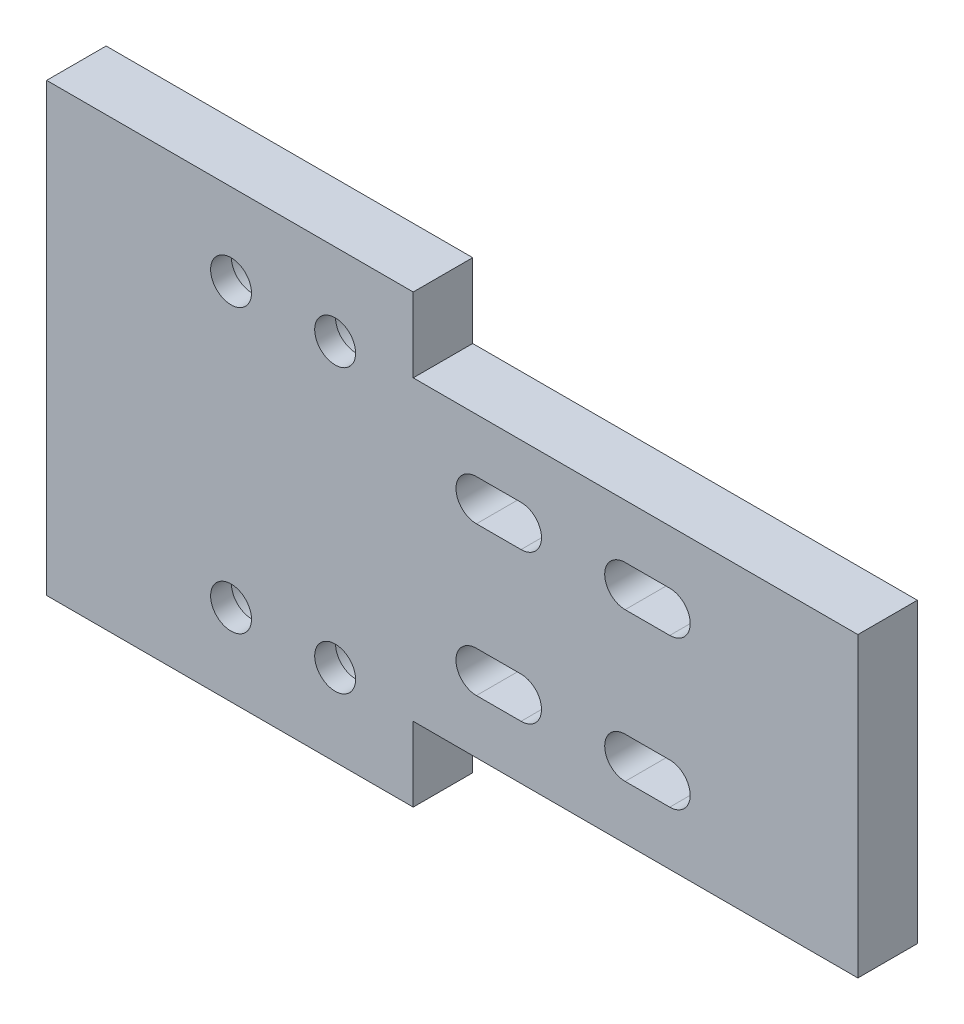
ISO-10303-21;
HEADER;
FILE_DESCRIPTION(('STEP AP214'),'2;1');
FILE_NAME('part.step','',(''),(''),'','','');
FILE_SCHEMA(('AUTOMOTIVE_DESIGN { 1 0 10303 214 1 1 1 1 }'));
ENDSEC;
DATA;
#1=APPLICATION_CONTEXT('core data for automotive mechanical design processes');
#2=APPLICATION_PROTOCOL_DEFINITION('international standard','automotive_design',2000,#1);
#3=PRODUCT_CONTEXT('',#1,'mechanical');
#4=PRODUCT('Part','Part','',(#3));
#5=PRODUCT_RELATED_PRODUCT_CATEGORY('part','',(#4));
#6=PRODUCT_DEFINITION_FORMATION('','',#4);
#7=PRODUCT_DEFINITION_CONTEXT('part definition',#1,'design');
#8=PRODUCT_DEFINITION('design','',#6,#7);
#9=PRODUCT_DEFINITION_SHAPE('','',#8);
#10=(LENGTH_UNIT() NAMED_UNIT(*) SI_UNIT(.MILLI.,.METRE.));
#11=(NAMED_UNIT(*) PLANE_ANGLE_UNIT() SI_UNIT($,.RADIAN.));
#12=(NAMED_UNIT(*) SI_UNIT($,.STERADIAN.) SOLID_ANGLE_UNIT());
#13=UNCERTAINTY_MEASURE_WITH_UNIT(LENGTH_MEASURE(1.E-05),#10,'distance_accuracy_value','');
#14=(GEOMETRIC_REPRESENTATION_CONTEXT(3) GLOBAL_UNCERTAINTY_ASSIGNED_CONTEXT((#13)) GLOBAL_UNIT_ASSIGNED_CONTEXT((#10,
#11,#12)) REPRESENTATION_CONTEXT('',''));
#15=CARTESIAN_POINT('',(0.,0.,0.));
#16=DIRECTION('',(0.,0.,1.));
#17=DIRECTION('',(1.,0.,0.));
#18=AXIS2_PLACEMENT_3D('',#15,#16,#17);
#19=CARTESIAN_POINT('',(336.3,320.,246.));
#20=DIRECTION('',(0.,-1.,0.));
#21=DIRECTION('',(0.,0.,-1.));
#22=AXIS2_PLACEMENT_3D('',#19,#20,#21);
#23=PLANE('',#22);
#24=DIRECTION('',(0.,0.,-1.));
#25=VECTOR('',#24,1.);
#26=CARTESIAN_POINT('',(276.5,320.,246.));
#27=LINE('',#26,#25);
#28=CARTESIAN_POINT('',(276.5,320.,246.));
#29=VERTEX_POINT('',#28);
#30=CARTESIAN_POINT('',(276.5,320.,238.));
#31=VERTEX_POINT('',#30);
#32=EDGE_CURVE('E56',#29,#31,#27,.T.);
#33=ORIENTED_EDGE('',*,*,#32,.F.);
#34=DIRECTION('',(-1.,0.,0.));
#35=VECTOR('',#34,1.);
#36=CARTESIAN_POINT('',(336.3,320.,246.));
#37=LINE('',#36,#35);
#38=CARTESIAN_POINT('',(336.3,320.,246.));
#39=VERTEX_POINT('',#38);
#40=EDGE_CURVE('E212',#39,#29,#37,.T.);
#41=ORIENTED_EDGE('',*,*,#40,.F.);
#42=DIRECTION('',(0.,0.,-1.));
#43=VECTOR('',#42,1.);
#44=CARTESIAN_POINT('',(336.3,320.,246.));
#45=LINE('',#44,#43);
#46=CARTESIAN_POINT('',(336.3,320.,238.));
#47=VERTEX_POINT('',#46);
#48=EDGE_CURVE('E48',#39,#47,#45,.T.);
#49=ORIENTED_EDGE('',*,*,#48,.T.);
#50=DIRECTION('',(-1.,0.,0.));
#51=VECTOR('',#50,1.);
#52=CARTESIAN_POINT('',(336.3,320.,238.));
#53=LINE('',#52,#51);
#54=EDGE_CURVE('E378',#47,#31,#53,.T.);
#55=ORIENTED_EDGE('',*,*,#54,.T.);
#56=EDGE_LOOP('',(#33,#41,#49,#55));
#57=FACE_BOUND('',#56,.T.);
#58=ADVANCED_FACE('F39',(#57),#23,.F.);
#59=CARTESIAN_POINT('',(0.,0.,246.));
#60=DIRECTION('',(0.,0.,1.));
#61=DIRECTION('',(1.,0.,0.));
#62=AXIS2_PLACEMENT_3D('',#59,#60,#61);
#63=PLANE('',#62);
#64=CARTESIAN_POINT('',(252.,319.,246.));
#65=DIRECTION('',(0.,0.,1.));
#66=DIRECTION('',(1.,0.,0.));
#67=AXIS2_PLACEMENT_3D('',#64,#65,#66);
#68=CIRCLE('',#67,2.74999999999997);
#69=CARTESIAN_POINT('',(254.75,319.,246.));
#70=VERTEX_POINT('',#69);
#71=EDGE_CURVE('E411',#70,#70,#68,.T.);
#72=ORIENTED_EDGE('',*,*,#71,.F.);
#73=EDGE_LOOP('',(#72));
#74=FACE_BOUND('',#73,.T.);
#75=CARTESIAN_POINT('',(266.,281.,246.));
#76=DIRECTION('',(0.,0.,1.));
#77=DIRECTION('',(1.,0.,0.));
#78=AXIS2_PLACEMENT_3D('',#75,#76,#77);
#79=CIRCLE('',#78,2.74999999999997);
#80=CARTESIAN_POINT('',(268.75,281.,246.));
#81=VERTEX_POINT('',#80);
#82=EDGE_CURVE('E406',#81,#81,#79,.T.);
#83=ORIENTED_EDGE('',*,*,#82,.F.);
#84=EDGE_LOOP('',(#83));
#85=FACE_BOUND('',#84,.T.);
#86=CARTESIAN_POINT('',(266.,319.,246.));
#87=DIRECTION('',(0.,0.,1.));
#88=DIRECTION('',(1.,0.,0.));
#89=AXIS2_PLACEMENT_3D('',#86,#87,#88);
#90=CIRCLE('',#89,2.74999999999997);
#91=CARTESIAN_POINT('',(268.75,319.,246.));
#92=VERTEX_POINT('',#91);
#93=EDGE_CURVE('E402',#92,#92,#90,.T.);
#94=ORIENTED_EDGE('',*,*,#93,.F.);
#95=EDGE_LOOP('',(#94));
#96=FACE_BOUND('',#95,.T.);
#97=CARTESIAN_POINT('',(252.,281.,246.));
#98=DIRECTION('',(0.,0.,1.));
#99=DIRECTION('',(1.,0.,0.));
#100=AXIS2_PLACEMENT_3D('',#97,#98,#99);
#101=CIRCLE('',#100,2.74999999999997);
#102=CARTESIAN_POINT('',(254.75,281.,246.));
#103=VERTEX_POINT('',#102);
#104=EDGE_CURVE('E233',#103,#103,#101,.T.);
#105=ORIENTED_EDGE('',*,*,#104,.F.);
#106=EDGE_LOOP('',(#105));
#107=FACE_BOUND('',#106,.T.);
#108=DIRECTION('',(0.,-1.,0.));
#109=VECTOR('',#108,1.);
#110=CARTESIAN_POINT('',(227.2,320.,246.));
#111=LINE('',#110,#109);
#112=CARTESIAN_POINT('',(227.2,330.,246.));
#113=VERTEX_POINT('',#112);
#114=CARTESIAN_POINT('',(227.2,270.,246.));
#115=VERTEX_POINT('',#114);
#116=EDGE_CURVE('E375',#113,#115,#111,.T.);
#117=ORIENTED_EDGE('',*,*,#116,.T.);
#118=DIRECTION('',(1.,0.,0.));
#119=VECTOR('',#118,1.);
#120=CARTESIAN_POINT('',(227.2,270.,246.));
#121=LINE('',#120,#119);
#122=CARTESIAN_POINT('',(276.5,270.,246.));
#123=VERTEX_POINT('',#122);
#124=EDGE_CURVE('E237',#115,#123,#121,.T.);
#125=ORIENTED_EDGE('',*,*,#124,.T.);
#126=DIRECTION('',(0.,1.,0.));
#127=VECTOR('',#126,1.);
#128=CARTESIAN_POINT('',(276.5,270.,246.));
#129=LINE('',#128,#127);
#130=CARTESIAN_POINT('',(276.5,280.,246.));
#131=VERTEX_POINT('',#130);
#132=EDGE_CURVE('E239',#123,#131,#129,.T.);
#133=ORIENTED_EDGE('',*,*,#132,.T.);
#134=DIRECTION('',(1.,0.,0.));
#135=VECTOR('',#134,1.);
#136=CARTESIAN_POINT('',(227.2,280.,246.));
#137=LINE('',#136,#135);
#138=CARTESIAN_POINT('',(336.3,280.,246.));
#139=VERTEX_POINT('',#138);
#140=EDGE_CURVE('E377',#131,#139,#137,.T.);
#141=ORIENTED_EDGE('',*,*,#140,.T.);
#142=DIRECTION('',(0.,1.,0.));
#143=VECTOR('',#142,1.);
#144=CARTESIAN_POINT('',(336.3,280.,246.));
#145=LINE('',#144,#143);
#146=EDGE_CURVE('E380',#139,#39,#145,.T.);
#147=ORIENTED_EDGE('',*,*,#146,.T.);
#148=ORIENTED_EDGE('',*,*,#40,.T.);
#149=DIRECTION('',(0.,1.,0.));
#150=VECTOR('',#149,1.);
#151=CARTESIAN_POINT('',(276.5,320.,246.));
#152=LINE('',#151,#150);
#153=CARTESIAN_POINT('',(276.5,330.,246.));
#154=VERTEX_POINT('',#153);
#155=EDGE_CURVE('E205',#29,#154,#152,.T.);
#156=ORIENTED_EDGE('',*,*,#155,.T.);
#157=DIRECTION('',(-1.,0.,0.));
#158=VECTOR('',#157,1.);
#159=CARTESIAN_POINT('',(276.5,330.,246.));
#160=LINE('',#159,#158);
#161=EDGE_CURVE('E210',#154,#113,#160,.T.);
#162=ORIENTED_EDGE('',*,*,#161,.T.);
#163=EDGE_LOOP('',(#117,#125,#133,#141,#147,#148,#156,#162));
#164=FACE_BOUND('',#163,.T.);
#165=DIRECTION('',(1.,0.,0.));
#166=VECTOR('',#165,1.);
#167=CARTESIAN_POINT('',(285.,287.25,246.));
#168=LINE('',#167,#166);
#169=CARTESIAN_POINT('',(285.,287.25,246.));
#170=VERTEX_POINT('',#169);
#171=CARTESIAN_POINT('',(291.,287.25,246.));
#172=VERTEX_POINT('',#171);
#173=EDGE_CURVE('E346',#170,#172,#168,.T.);
#174=ORIENTED_EDGE('',*,*,#173,.F.);
#175=CARTESIAN_POINT('',(285.,290.,246.));
#176=DIRECTION('',(0.,0.,1.));
#177=DIRECTION('',(1.,0.,0.));
#178=AXIS2_PLACEMENT_3D('',#175,#176,#177);
#179=CIRCLE('',#178,2.75);
#180=CARTESIAN_POINT('',(285.,292.75,246.));
#181=VERTEX_POINT('',#180);
#182=EDGE_CURVE('E344',#181,#170,#179,.T.);
#183=ORIENTED_EDGE('',*,*,#182,.F.);
#184=DIRECTION('',(-1.,0.,0.));
#185=VECTOR('',#184,1.);
#186=CARTESIAN_POINT('',(291.,292.75,246.));
#187=LINE('',#186,#185);
#188=CARTESIAN_POINT('',(291.,292.75,246.));
#189=VERTEX_POINT('',#188);
#190=EDGE_CURVE('E352',#189,#181,#187,.T.);
#191=ORIENTED_EDGE('',*,*,#190,.F.);
#192=CARTESIAN_POINT('',(291.,290.,246.));
#193=DIRECTION('',(0.,0.,1.));
#194=DIRECTION('',(1.,0.,0.));
#195=AXIS2_PLACEMENT_3D('',#192,#193,#194);
#196=CIRCLE('',#195,2.75);
#197=EDGE_CURVE('E349',#172,#189,#196,.T.);
#198=ORIENTED_EDGE('',*,*,#197,.F.);
#199=EDGE_LOOP('',(#174,#183,#191,#198));
#200=FACE_BOUND('',#199,.T.);
#201=DIRECTION('',(1.,0.,0.));
#202=VECTOR('',#201,1.);
#203=CARTESIAN_POINT('',(285.,307.25,246.));
#204=LINE('',#203,#202);
#205=CARTESIAN_POINT('',(285.,307.25,246.));
#206=VERTEX_POINT('',#205);
#207=CARTESIAN_POINT('',(291.,307.25,246.));
#208=VERTEX_POINT('',#207);
#209=EDGE_CURVE('E315',#206,#208,#204,.T.);
#210=ORIENTED_EDGE('',*,*,#209,.F.);
#211=CARTESIAN_POINT('',(285.,310.,246.));
#212=DIRECTION('',(0.,0.,1.));
#213=DIRECTION('',(1.,0.,0.));
#214=AXIS2_PLACEMENT_3D('',#211,#212,#213);
#215=CIRCLE('',#214,2.75);
#216=CARTESIAN_POINT('',(285.,312.75,246.));
#217=VERTEX_POINT('',#216);
#218=EDGE_CURVE('E313',#217,#206,#215,.T.);
#219=ORIENTED_EDGE('',*,*,#218,.F.);
#220=DIRECTION('',(-1.,0.,0.));
#221=VECTOR('',#220,1.);
#222=CARTESIAN_POINT('',(291.,312.75,246.));
#223=LINE('',#222,#221);
#224=CARTESIAN_POINT('',(291.,312.75,246.));
#225=VERTEX_POINT('',#224);
#226=EDGE_CURVE('E321',#225,#217,#223,.T.);
#227=ORIENTED_EDGE('',*,*,#226,.F.);
#228=CARTESIAN_POINT('',(291.,310.,246.));
#229=DIRECTION('',(0.,0.,1.));
#230=DIRECTION('',(1.,0.,0.));
#231=AXIS2_PLACEMENT_3D('',#228,#229,#230);
#232=CIRCLE('',#231,2.75);
#233=EDGE_CURVE('E318',#208,#225,#232,.T.);
#234=ORIENTED_EDGE('',*,*,#233,.F.);
#235=EDGE_LOOP('',(#210,#219,#227,#234));
#236=FACE_BOUND('',#235,.T.);
#237=DIRECTION('',(1.,0.,0.));
#238=VECTOR('',#237,1.);
#239=CARTESIAN_POINT('',(305.,287.25,246.));
#240=LINE('',#239,#238);
#241=CARTESIAN_POINT('',(305.,287.25,246.));
#242=VERTEX_POINT('',#241);
#243=CARTESIAN_POINT('',(311.,287.25,246.));
#244=VERTEX_POINT('',#243);
#245=EDGE_CURVE('E284',#242,#244,#240,.T.);
#246=ORIENTED_EDGE('',*,*,#245,.F.);
#247=CARTESIAN_POINT('',(305.,290.,246.));
#248=DIRECTION('',(0.,0.,1.));
#249=DIRECTION('',(1.,0.,0.));
#250=AXIS2_PLACEMENT_3D('',#247,#248,#249);
#251=CIRCLE('',#250,2.75);
#252=CARTESIAN_POINT('',(305.,292.75,246.));
#253=VERTEX_POINT('',#252);
#254=EDGE_CURVE('E282',#253,#242,#251,.T.);
#255=ORIENTED_EDGE('',*,*,#254,.F.);
#256=DIRECTION('',(-1.,0.,0.));
#257=VECTOR('',#256,1.);
#258=CARTESIAN_POINT('',(311.,292.75,246.));
#259=LINE('',#258,#257);
#260=CARTESIAN_POINT('',(311.,292.75,246.));
#261=VERTEX_POINT('',#260);
#262=EDGE_CURVE('E290',#261,#253,#259,.T.);
#263=ORIENTED_EDGE('',*,*,#262,.F.);
#264=CARTESIAN_POINT('',(311.,290.,246.));
#265=DIRECTION('',(0.,0.,1.));
#266=DIRECTION('',(1.,0.,0.));
#267=AXIS2_PLACEMENT_3D('',#264,#265,#266);
#268=CIRCLE('',#267,2.75);
#269=EDGE_CURVE('E287',#244,#261,#268,.T.);
#270=ORIENTED_EDGE('',*,*,#269,.F.);
#271=EDGE_LOOP('',(#246,#255,#263,#270));
#272=FACE_BOUND('',#271,.T.);
#273=DIRECTION('',(1.,0.,0.));
#274=VECTOR('',#273,1.);
#275=CARTESIAN_POINT('',(305.,307.25,246.));
#276=LINE('',#275,#274);
#277=CARTESIAN_POINT('',(305.,307.25,246.));
#278=VERTEX_POINT('',#277);
#279=CARTESIAN_POINT('',(311.,307.25,246.));
#280=VERTEX_POINT('',#279);
#281=EDGE_CURVE('E253',#278,#280,#276,.T.);
#282=ORIENTED_EDGE('',*,*,#281,.F.);
#283=CARTESIAN_POINT('',(305.,310.,246.));
#284=DIRECTION('',(0.,0.,1.));
#285=DIRECTION('',(1.,0.,0.));
#286=AXIS2_PLACEMENT_3D('',#283,#284,#285);
#287=CIRCLE('',#286,2.75);
#288=CARTESIAN_POINT('',(305.,312.75,246.));
#289=VERTEX_POINT('',#288);
#290=EDGE_CURVE('E251',#289,#278,#287,.T.);
#291=ORIENTED_EDGE('',*,*,#290,.F.);
#292=DIRECTION('',(-1.,0.,0.));
#293=VECTOR('',#292,1.);
#294=CARTESIAN_POINT('',(311.,312.75,246.));
#295=LINE('',#294,#293);
#296=CARTESIAN_POINT('',(311.,312.75,246.));
#297=VERTEX_POINT('',#296);
#298=EDGE_CURVE('E259',#297,#289,#295,.T.);
#299=ORIENTED_EDGE('',*,*,#298,.F.);
#300=CARTESIAN_POINT('',(311.,310.,246.));
#301=DIRECTION('',(0.,0.,1.));
#302=DIRECTION('',(1.,0.,0.));
#303=AXIS2_PLACEMENT_3D('',#300,#301,#302);
#304=CIRCLE('',#303,2.75);
#305=EDGE_CURVE('E256',#280,#297,#304,.T.);
#306=ORIENTED_EDGE('',*,*,#305,.F.);
#307=EDGE_LOOP('',(#282,#291,#299,#306));
#308=FACE_BOUND('',#307,.T.);
#309=ADVANCED_FACE('F207',(#74,#85,#96,#107,#164,#200,#236,#272,#308),#63,.T.);
#310=CARTESIAN_POINT('',(0.,0.,238.));
#311=DIRECTION('',(0.,0.,1.));
#312=DIRECTION('',(1.,0.,0.));
#313=AXIS2_PLACEMENT_3D('',#310,#311,#312);
#314=PLANE('',#313);
#315=CARTESIAN_POINT('',(252.,319.,238.));
#316=DIRECTION('',(0.,0.,1.));
#317=DIRECTION('',(1.,0.,0.));
#318=AXIS2_PLACEMENT_3D('',#315,#316,#317);
#319=CIRCLE('',#318,5.);
#320=CARTESIAN_POINT('',(257.,319.,238.));
#321=VERTEX_POINT('',#320);
#322=EDGE_CURVE('E868',#321,#321,#319,.T.);
#323=ORIENTED_EDGE('',*,*,#322,.T.);
#324=EDGE_LOOP('',(#323));
#325=FACE_BOUND('',#324,.T.);
#326=CARTESIAN_POINT('',(266.,281.,238.));
#327=DIRECTION('',(0.,0.,1.));
#328=DIRECTION('',(1.,0.,0.));
#329=AXIS2_PLACEMENT_3D('',#326,#327,#328);
#330=CIRCLE('',#329,5.);
#331=CARTESIAN_POINT('',(271.,281.,238.));
#332=VERTEX_POINT('',#331);
#333=EDGE_CURVE('E873',#332,#332,#330,.T.);
#334=ORIENTED_EDGE('',*,*,#333,.T.);
#335=EDGE_LOOP('',(#334));
#336=FACE_BOUND('',#335,.T.);
#337=CARTESIAN_POINT('',(266.,319.,238.));
#338=DIRECTION('',(0.,0.,1.));
#339=DIRECTION('',(1.,0.,0.));
#340=AXIS2_PLACEMENT_3D('',#337,#338,#339);
#341=CIRCLE('',#340,5.);
#342=CARTESIAN_POINT('',(271.,319.,238.));
#343=VERTEX_POINT('',#342);
#344=EDGE_CURVE('E874',#343,#343,#341,.T.);
#345=ORIENTED_EDGE('',*,*,#344,.T.);
#346=EDGE_LOOP('',(#345));
#347=FACE_BOUND('',#346,.T.);
#348=CARTESIAN_POINT('',(252.,281.,238.));
#349=DIRECTION('',(0.,0.,1.));
#350=DIRECTION('',(1.,0.,0.));
#351=AXIS2_PLACEMENT_3D('',#348,#349,#350);
#352=CIRCLE('',#351,5.);
#353=CARTESIAN_POINT('',(257.,281.,238.));
#354=VERTEX_POINT('',#353);
#355=EDGE_CURVE('E415',#354,#354,#352,.T.);
#356=ORIENTED_EDGE('',*,*,#355,.T.);
#357=EDGE_LOOP('',(#356));
#358=FACE_BOUND('',#357,.T.);
#359=CARTESIAN_POINT('',(305.,290.,238.));
#360=DIRECTION('',(0.,0.,1.));
#361=DIRECTION('',(1.,0.,0.));
#362=AXIS2_PLACEMENT_3D('',#359,#360,#361);
#363=CIRCLE('',#362,2.75);
#364=CARTESIAN_POINT('',(305.,292.75,238.));
#365=VERTEX_POINT('',#364);
#366=CARTESIAN_POINT('',(305.,287.25,238.));
#367=VERTEX_POINT('',#366);
#368=EDGE_CURVE('E281',#365,#367,#363,.T.);
#369=ORIENTED_EDGE('',*,*,#368,.T.);
#370=DIRECTION('',(1.,0.,0.));
#371=VECTOR('',#370,1.);
#372=CARTESIAN_POINT('',(305.,287.25,238.));
#373=LINE('',#372,#371);
#374=CARTESIAN_POINT('',(311.,287.25,238.));
#375=VERTEX_POINT('',#374);
#376=EDGE_CURVE('E295',#367,#375,#373,.T.);
#377=ORIENTED_EDGE('',*,*,#376,.T.);
#378=CARTESIAN_POINT('',(311.,290.,238.));
#379=DIRECTION('',(0.,0.,1.));
#380=DIRECTION('',(1.,0.,0.));
#381=AXIS2_PLACEMENT_3D('',#378,#379,#380);
#382=CIRCLE('',#381,2.75);
#383=CARTESIAN_POINT('',(311.,292.75,238.));
#384=VERTEX_POINT('',#383);
#385=EDGE_CURVE('E298',#375,#384,#382,.T.);
#386=ORIENTED_EDGE('',*,*,#385,.T.);
#387=DIRECTION('',(-1.,0.,0.));
#388=VECTOR('',#387,1.);
#389=CARTESIAN_POINT('',(311.,292.75,238.));
#390=LINE('',#389,#388);
#391=EDGE_CURVE('E285',#384,#365,#390,.T.);
#392=ORIENTED_EDGE('',*,*,#391,.T.);
#393=EDGE_LOOP('',(#369,#377,#386,#392));
#394=FACE_BOUND('',#393,.T.);
#395=CARTESIAN_POINT('',(285.,290.,238.));
#396=DIRECTION('',(0.,0.,1.));
#397=DIRECTION('',(1.,0.,0.));
#398=AXIS2_PLACEMENT_3D('',#395,#396,#397);
#399=CIRCLE('',#398,2.75);
#400=CARTESIAN_POINT('',(285.,292.75,238.));
#401=VERTEX_POINT('',#400);
#402=CARTESIAN_POINT('',(285.,287.25,238.));
#403=VERTEX_POINT('',#402);
#404=EDGE_CURVE('E343',#401,#403,#399,.T.);
#405=ORIENTED_EDGE('',*,*,#404,.T.);
#406=DIRECTION('',(1.,0.,0.));
#407=VECTOR('',#406,1.);
#408=CARTESIAN_POINT('',(285.,287.25,238.));
#409=LINE('',#408,#407);
#410=CARTESIAN_POINT('',(291.,287.25,238.));
#411=VERTEX_POINT('',#410);
#412=EDGE_CURVE('E357',#403,#411,#409,.T.);
#413=ORIENTED_EDGE('',*,*,#412,.T.);
#414=CARTESIAN_POINT('',(291.,290.,238.));
#415=DIRECTION('',(0.,0.,1.));
#416=DIRECTION('',(1.,0.,0.));
#417=AXIS2_PLACEMENT_3D('',#414,#415,#416);
#418=CIRCLE('',#417,2.75);
#419=CARTESIAN_POINT('',(291.,292.75,238.));
#420=VERTEX_POINT('',#419);
#421=EDGE_CURVE('E360',#411,#420,#418,.T.);
#422=ORIENTED_EDGE('',*,*,#421,.T.);
#423=DIRECTION('',(-1.,0.,0.));
#424=VECTOR('',#423,1.);
#425=CARTESIAN_POINT('',(291.,292.75,238.));
#426=LINE('',#425,#424);
#427=EDGE_CURVE('E347',#420,#401,#426,.T.);
#428=ORIENTED_EDGE('',*,*,#427,.T.);
#429=EDGE_LOOP('',(#405,#413,#422,#428));
#430=FACE_BOUND('',#429,.T.);
#431=DIRECTION('',(0.,-1.,0.));
#432=VECTOR('',#431,1.);
#433=CARTESIAN_POINT('',(227.2,320.,238.));
#434=LINE('',#433,#432);
#435=CARTESIAN_POINT('',(227.2,330.,238.));
#436=VERTEX_POINT('',#435);
#437=CARTESIAN_POINT('',(227.2,270.,238.));
#438=VERTEX_POINT('',#437);
#439=EDGE_CURVE('E374',#436,#438,#434,.T.);
#440=ORIENTED_EDGE('',*,*,#439,.F.);
#441=DIRECTION('',(-1.,0.,0.));
#442=VECTOR('',#441,1.);
#443=CARTESIAN_POINT('',(276.5,330.,238.));
#444=LINE('',#443,#442);
#445=CARTESIAN_POINT('',(276.5,330.,238.));
#446=VERTEX_POINT('',#445);
#447=EDGE_CURVE('E214',#446,#436,#444,.T.);
#448=ORIENTED_EDGE('',*,*,#447,.F.);
#449=DIRECTION('',(0.,1.,0.));
#450=VECTOR('',#449,1.);
#451=CARTESIAN_POINT('',(276.5,320.,238.));
#452=LINE('',#451,#450);
#453=EDGE_CURVE('E220',#31,#446,#452,.T.);
#454=ORIENTED_EDGE('',*,*,#453,.F.);
#455=ORIENTED_EDGE('',*,*,#54,.F.);
#456=DIRECTION('',(0.,1.,0.));
#457=VECTOR('',#456,1.);
#458=CARTESIAN_POINT('',(336.3,280.,238.));
#459=LINE('',#458,#457);
#460=CARTESIAN_POINT('',(336.3,280.,238.));
#461=VERTEX_POINT('',#460);
#462=EDGE_CURVE('E386',#461,#47,#459,.T.);
#463=ORIENTED_EDGE('',*,*,#462,.F.);
#464=DIRECTION('',(1.,0.,0.));
#465=VECTOR('',#464,1.);
#466=CARTESIAN_POINT('',(227.2,280.,238.));
#467=LINE('',#466,#465);
#468=CARTESIAN_POINT('',(276.5,280.,238.));
#469=VERTEX_POINT('',#468);
#470=EDGE_CURVE('E384',#469,#461,#467,.T.);
#471=ORIENTED_EDGE('',*,*,#470,.F.);
#472=DIRECTION('',(0.,1.,0.));
#473=VECTOR('',#472,1.);
#474=CARTESIAN_POINT('',(276.5,270.,238.));
#475=LINE('',#474,#473);
#476=CARTESIAN_POINT('',(276.5,270.,238.));
#477=VERTEX_POINT('',#476);
#478=EDGE_CURVE('E64',#477,#469,#475,.T.);
#479=ORIENTED_EDGE('',*,*,#478,.F.);
#480=DIRECTION('',(1.,0.,0.));
#481=VECTOR('',#480,1.);
#482=CARTESIAN_POINT('',(227.2,270.,238.));
#483=LINE('',#482,#481);
#484=EDGE_CURVE('E236',#438,#477,#483,.T.);
#485=ORIENTED_EDGE('',*,*,#484,.F.);
#486=EDGE_LOOP('',(#440,#448,#454,#455,#463,#471,#479,#485));
#487=FACE_BOUND('',#486,.T.);
#488=CARTESIAN_POINT('',(285.,310.,238.));
#489=DIRECTION('',(0.,0.,1.));
#490=DIRECTION('',(1.,0.,0.));
#491=AXIS2_PLACEMENT_3D('',#488,#489,#490);
#492=CIRCLE('',#491,2.75);
#493=CARTESIAN_POINT('',(285.,312.75,238.));
#494=VERTEX_POINT('',#493);
#495=CARTESIAN_POINT('',(285.,307.25,238.));
#496=VERTEX_POINT('',#495);
#497=EDGE_CURVE('E312',#494,#496,#492,.T.);
#498=ORIENTED_EDGE('',*,*,#497,.T.);
#499=DIRECTION('',(1.,0.,0.));
#500=VECTOR('',#499,1.);
#501=CARTESIAN_POINT('',(285.,307.25,238.));
#502=LINE('',#501,#500);
#503=CARTESIAN_POINT('',(291.,307.25,238.));
#504=VERTEX_POINT('',#503);
#505=EDGE_CURVE('E326',#496,#504,#502,.T.);
#506=ORIENTED_EDGE('',*,*,#505,.T.);
#507=CARTESIAN_POINT('',(291.,310.,238.));
#508=DIRECTION('',(0.,0.,1.));
#509=DIRECTION('',(1.,0.,0.));
#510=AXIS2_PLACEMENT_3D('',#507,#508,#509);
#511=CIRCLE('',#510,2.75);
#512=CARTESIAN_POINT('',(291.,312.75,238.));
#513=VERTEX_POINT('',#512);
#514=EDGE_CURVE('E329',#504,#513,#511,.T.);
#515=ORIENTED_EDGE('',*,*,#514,.T.);
#516=DIRECTION('',(-1.,0.,0.));
#517=VECTOR('',#516,1.);
#518=CARTESIAN_POINT('',(291.,312.75,238.));
#519=LINE('',#518,#517);
#520=EDGE_CURVE('E316',#513,#494,#519,.T.);
#521=ORIENTED_EDGE('',*,*,#520,.T.);
#522=EDGE_LOOP('',(#498,#506,#515,#521));
#523=FACE_BOUND('',#522,.T.);
#524=CARTESIAN_POINT('',(305.,310.,238.));
#525=DIRECTION('',(0.,0.,1.));
#526=DIRECTION('',(1.,0.,0.));
#527=AXIS2_PLACEMENT_3D('',#524,#525,#526);
#528=CIRCLE('',#527,2.75);
#529=CARTESIAN_POINT('',(305.,312.75,238.));
#530=VERTEX_POINT('',#529);
#531=CARTESIAN_POINT('',(305.,307.25,238.));
#532=VERTEX_POINT('',#531);
#533=EDGE_CURVE('E250',#530,#532,#528,.T.);
#534=ORIENTED_EDGE('',*,*,#533,.T.);
#535=DIRECTION('',(1.,0.,0.));
#536=VECTOR('',#535,1.);
#537=CARTESIAN_POINT('',(305.,307.25,238.));
#538=LINE('',#537,#536);
#539=CARTESIAN_POINT('',(311.,307.25,238.));
#540=VERTEX_POINT('',#539);
#541=EDGE_CURVE('E264',#532,#540,#538,.T.);
#542=ORIENTED_EDGE('',*,*,#541,.T.);
#543=CARTESIAN_POINT('',(311.,310.,238.));
#544=DIRECTION('',(0.,0.,1.));
#545=DIRECTION('',(1.,0.,0.));
#546=AXIS2_PLACEMENT_3D('',#543,#544,#545);
#547=CIRCLE('',#546,2.75);
#548=CARTESIAN_POINT('',(311.,312.75,238.));
#549=VERTEX_POINT('',#548);
#550=EDGE_CURVE('E267',#540,#549,#547,.T.);
#551=ORIENTED_EDGE('',*,*,#550,.T.);
#552=DIRECTION('',(-1.,0.,0.));
#553=VECTOR('',#552,1.);
#554=CARTESIAN_POINT('',(311.,312.75,238.));
#555=LINE('',#554,#553);
#556=EDGE_CURVE('E254',#549,#530,#555,.T.);
#557=ORIENTED_EDGE('',*,*,#556,.T.);
#558=EDGE_LOOP('',(#534,#542,#551,#557));
#559=FACE_BOUND('',#558,.T.);
#560=ADVANCED_FACE('F424',(#325,#336,#347,#358,#394,#430,#487,#523,#559),#314,.F.);
#561=CARTESIAN_POINT('',(227.2,320.,246.));
#562=DIRECTION('',(1.,0.,0.));
#563=DIRECTION('',(0.,0.,-1.));
#564=AXIS2_PLACEMENT_3D('',#561,#562,#563);
#565=PLANE('',#564);
#566=ORIENTED_EDGE('',*,*,#439,.T.);
#567=DIRECTION('',(0.,0.,-1.));
#568=VECTOR('',#567,1.);
#569=CARTESIAN_POINT('',(227.2,270.,246.));
#570=LINE('',#569,#568);
#571=EDGE_CURVE('E247',#115,#438,#570,.T.);
#572=ORIENTED_EDGE('',*,*,#571,.F.);
#573=ORIENTED_EDGE('',*,*,#116,.F.);
#574=DIRECTION('',(0.,0.,-1.));
#575=VECTOR('',#574,1.);
#576=CARTESIAN_POINT('',(227.2,330.,246.));
#577=LINE('',#576,#575);
#578=EDGE_CURVE('E224',#113,#436,#577,.T.);
#579=ORIENTED_EDGE('',*,*,#578,.T.);
#580=EDGE_LOOP('',(#566,#572,#573,#579));
#581=FACE_BOUND('',#580,.T.);
#582=ADVANCED_FACE('F41',(#581),#565,.F.);
#583=CARTESIAN_POINT('',(227.2,280.,246.));
#584=DIRECTION('',(0.,1.,0.));
#585=DIRECTION('',(0.,0.,1.));
#586=AXIS2_PLACEMENT_3D('',#583,#584,#585);
#587=PLANE('',#586);
#588=ORIENTED_EDGE('',*,*,#140,.F.);
#589=DIRECTION('',(0.,0.,-1.));
#590=VECTOR('',#589,1.);
#591=CARTESIAN_POINT('',(276.5,280.,246.));
#592=LINE('',#591,#590);
#593=EDGE_CURVE('E241',#131,#469,#592,.T.);
#594=ORIENTED_EDGE('',*,*,#593,.T.);
#595=ORIENTED_EDGE('',*,*,#470,.T.);
#596=DIRECTION('',(0.,0.,-1.));
#597=VECTOR('',#596,1.);
#598=CARTESIAN_POINT('',(336.3,280.,246.));
#599=LINE('',#598,#597);
#600=EDGE_CURVE('E11',#139,#461,#599,.T.);
#601=ORIENTED_EDGE('',*,*,#600,.F.);
#602=EDGE_LOOP('',(#588,#594,#595,#601));
#603=FACE_BOUND('',#602,.T.);
#604=ADVANCED_FACE('F443',(#603),#587,.F.);
#605=CARTESIAN_POINT('',(336.3,280.,246.));
#606=DIRECTION('',(-1.,0.,0.));
#607=DIRECTION('',(0.,0.,1.));
#608=AXIS2_PLACEMENT_3D('',#605,#606,#607);
#609=PLANE('',#608);
#610=ORIENTED_EDGE('',*,*,#462,.T.);
#611=ORIENTED_EDGE('',*,*,#48,.F.);
#612=ORIENTED_EDGE('',*,*,#146,.F.);
#613=ORIENTED_EDGE('',*,*,#600,.T.);
#614=EDGE_LOOP('',(#610,#611,#612,#613));
#615=FACE_BOUND('',#614,.T.);
#616=ADVANCED_FACE('F441',(#615),#609,.F.);
#617=CARTESIAN_POINT('',(285.,290.,246.));
#618=DIRECTION('',(0.,0.,-1.));
#619=DIRECTION('',(-1.,0.,0.));
#620=AXIS2_PLACEMENT_3D('',#617,#618,#619);
#621=CYLINDRICAL_SURFACE('',#620,2.75);
#622=ORIENTED_EDGE('',*,*,#404,.F.);
#623=DIRECTION('',(0.,0.,-1.));
#624=VECTOR('',#623,1.);
#625=CARTESIAN_POINT('',(285.,292.75,246.));
#626=LINE('',#625,#624);
#627=EDGE_CURVE('E354',#181,#401,#626,.T.);
#628=ORIENTED_EDGE('',*,*,#627,.F.);
#629=ORIENTED_EDGE('',*,*,#182,.T.);
#630=DIRECTION('',(0.,0.,-1.));
#631=VECTOR('',#630,1.);
#632=CARTESIAN_POINT('',(285.,287.25,246.));
#633=LINE('',#632,#631);
#634=EDGE_CURVE('E371',#170,#403,#633,.T.);
#635=ORIENTED_EDGE('',*,*,#634,.T.);
#636=EDGE_LOOP('',(#622,#628,#629,#635));
#637=FACE_BOUND('',#636,.T.);
#638=ADVANCED_FACE('F438',(#637),#621,.F.);
#639=CARTESIAN_POINT('',(285.,287.25,246.));
#640=DIRECTION('',(0.,1.,0.));
#641=DIRECTION('',(0.,0.,1.));
#642=AXIS2_PLACEMENT_3D('',#639,#640,#641);
#643=PLANE('',#642);
#644=ORIENTED_EDGE('',*,*,#412,.F.);
#645=ORIENTED_EDGE('',*,*,#634,.F.);
#646=ORIENTED_EDGE('',*,*,#173,.T.);
#647=DIRECTION('',(0.,0.,-1.));
#648=VECTOR('',#647,1.);
#649=CARTESIAN_POINT('',(291.,287.25,246.));
#650=LINE('',#649,#648);
#651=EDGE_CURVE('E369',#172,#411,#650,.T.);
#652=ORIENTED_EDGE('',*,*,#651,.T.);
#653=EDGE_LOOP('',(#644,#645,#646,#652));
#654=FACE_BOUND('',#653,.T.);
#655=ADVANCED_FACE('F526',(#654),#643,.T.);
#656=CARTESIAN_POINT('',(291.,290.,246.));
#657=DIRECTION('',(0.,0.,-1.));
#658=DIRECTION('',(-1.,0.,0.));
#659=AXIS2_PLACEMENT_3D('',#656,#657,#658);
#660=CYLINDRICAL_SURFACE('',#659,2.75);
#661=ORIENTED_EDGE('',*,*,#421,.F.);
#662=ORIENTED_EDGE('',*,*,#651,.F.);
#663=ORIENTED_EDGE('',*,*,#197,.T.);
#664=DIRECTION('',(0.,0.,-1.));
#665=VECTOR('',#664,1.);
#666=CARTESIAN_POINT('',(291.,292.75,246.));
#667=LINE('',#666,#665);
#668=EDGE_CURVE('E367',#189,#420,#667,.T.);
#669=ORIENTED_EDGE('',*,*,#668,.T.);
#670=EDGE_LOOP('',(#661,#662,#663,#669));
#671=FACE_BOUND('',#670,.T.);
#672=ADVANCED_FACE('F523',(#671),#660,.F.);
#673=CARTESIAN_POINT('',(291.,292.75,246.));
#674=DIRECTION('',(0.,-1.,0.));
#675=DIRECTION('',(0.,0.,-1.));
#676=AXIS2_PLACEMENT_3D('',#673,#674,#675);
#677=PLANE('',#676);
#678=ORIENTED_EDGE('',*,*,#427,.F.);
#679=ORIENTED_EDGE('',*,*,#668,.F.);
#680=ORIENTED_EDGE('',*,*,#190,.T.);
#681=ORIENTED_EDGE('',*,*,#627,.T.);
#682=EDGE_LOOP('',(#678,#679,#680,#681));
#683=FACE_BOUND('',#682,.T.);
#684=ADVANCED_FACE('F519',(#683),#677,.T.);
#685=CARTESIAN_POINT('',(285.,310.,246.));
#686=DIRECTION('',(0.,0.,-1.));
#687=DIRECTION('',(-1.,0.,0.));
#688=AXIS2_PLACEMENT_3D('',#685,#686,#687);
#689=CYLINDRICAL_SURFACE('',#688,2.75);
#690=ORIENTED_EDGE('',*,*,#497,.F.);
#691=DIRECTION('',(0.,0.,-1.));
#692=VECTOR('',#691,1.);
#693=CARTESIAN_POINT('',(285.,312.75,246.));
#694=LINE('',#693,#692);
#695=EDGE_CURVE('E323',#217,#494,#694,.T.);
#696=ORIENTED_EDGE('',*,*,#695,.F.);
#697=ORIENTED_EDGE('',*,*,#218,.T.);
#698=DIRECTION('',(0.,0.,-1.));
#699=VECTOR('',#698,1.);
#700=CARTESIAN_POINT('',(285.,307.25,246.));
#701=LINE('',#700,#699);
#702=EDGE_CURVE('E340',#206,#496,#701,.T.);
#703=ORIENTED_EDGE('',*,*,#702,.T.);
#704=EDGE_LOOP('',(#690,#696,#697,#703));
#705=FACE_BOUND('',#704,.T.);
#706=ADVANCED_FACE('F515',(#705),#689,.F.);
#707=CARTESIAN_POINT('',(285.,307.25,246.));
#708=DIRECTION('',(0.,1.,0.));
#709=DIRECTION('',(0.,0.,1.));
#710=AXIS2_PLACEMENT_3D('',#707,#708,#709);
#711=PLANE('',#710);
#712=ORIENTED_EDGE('',*,*,#505,.F.);
#713=ORIENTED_EDGE('',*,*,#702,.F.);
#714=ORIENTED_EDGE('',*,*,#209,.T.);
#715=DIRECTION('',(0.,0.,-1.));
#716=VECTOR('',#715,1.);
#717=CARTESIAN_POINT('',(291.,307.25,246.));
#718=LINE('',#717,#716);
#719=EDGE_CURVE('E338',#208,#504,#718,.T.);
#720=ORIENTED_EDGE('',*,*,#719,.T.);
#721=EDGE_LOOP('',(#712,#713,#714,#720));
#722=FACE_BOUND('',#721,.T.);
#723=ADVANCED_FACE('F511',(#722),#711,.T.);
#724=CARTESIAN_POINT('',(291.,310.,246.));
#725=DIRECTION('',(0.,0.,-1.));
#726=DIRECTION('',(-1.,0.,0.));
#727=AXIS2_PLACEMENT_3D('',#724,#725,#726);
#728=CYLINDRICAL_SURFACE('',#727,2.75);
#729=ORIENTED_EDGE('',*,*,#514,.F.);
#730=ORIENTED_EDGE('',*,*,#719,.F.);
#731=ORIENTED_EDGE('',*,*,#233,.T.);
#732=DIRECTION('',(0.,0.,-1.));
#733=VECTOR('',#732,1.);
#734=CARTESIAN_POINT('',(291.,312.75,246.));
#735=LINE('',#734,#733);
#736=EDGE_CURVE('E336',#225,#513,#735,.T.);
#737=ORIENTED_EDGE('',*,*,#736,.T.);
#738=EDGE_LOOP('',(#729,#730,#731,#737));
#739=FACE_BOUND('',#738,.T.);
#740=ADVANCED_FACE('F507',(#739),#728,.F.);
#741=CARTESIAN_POINT('',(291.,312.75,246.));
#742=DIRECTION('',(0.,-1.,0.));
#743=DIRECTION('',(0.,0.,-1.));
#744=AXIS2_PLACEMENT_3D('',#741,#742,#743);
#745=PLANE('',#744);
#746=ORIENTED_EDGE('',*,*,#520,.F.);
#747=ORIENTED_EDGE('',*,*,#736,.F.);
#748=ORIENTED_EDGE('',*,*,#226,.T.);
#749=ORIENTED_EDGE('',*,*,#695,.T.);
#750=EDGE_LOOP('',(#746,#747,#748,#749));
#751=FACE_BOUND('',#750,.T.);
#752=ADVANCED_FACE('F503',(#751),#745,.T.);
#753=CARTESIAN_POINT('',(305.,290.,246.));
#754=DIRECTION('',(0.,0.,-1.));
#755=DIRECTION('',(-1.,0.,0.));
#756=AXIS2_PLACEMENT_3D('',#753,#754,#755);
#757=CYLINDRICAL_SURFACE('',#756,2.75);
#758=ORIENTED_EDGE('',*,*,#368,.F.);
#759=DIRECTION('',(0.,0.,-1.));
#760=VECTOR('',#759,1.);
#761=CARTESIAN_POINT('',(305.,292.75,246.));
#762=LINE('',#761,#760);
#763=EDGE_CURVE('E292',#253,#365,#762,.T.);
#764=ORIENTED_EDGE('',*,*,#763,.F.);
#765=ORIENTED_EDGE('',*,*,#254,.T.);
#766=DIRECTION('',(0.,0.,-1.));
#767=VECTOR('',#766,1.);
#768=CARTESIAN_POINT('',(305.,287.25,246.));
#769=LINE('',#768,#767);
#770=EDGE_CURVE('E309',#242,#367,#769,.T.);
#771=ORIENTED_EDGE('',*,*,#770,.T.);
#772=EDGE_LOOP('',(#758,#764,#765,#771));
#773=FACE_BOUND('',#772,.T.);
#774=ADVANCED_FACE('F499',(#773),#757,.F.);
#775=CARTESIAN_POINT('',(305.,287.25,246.));
#776=DIRECTION('',(0.,1.,0.));
#777=DIRECTION('',(0.,0.,1.));
#778=AXIS2_PLACEMENT_3D('',#775,#776,#777);
#779=PLANE('',#778);
#780=ORIENTED_EDGE('',*,*,#376,.F.);
#781=ORIENTED_EDGE('',*,*,#770,.F.);
#782=ORIENTED_EDGE('',*,*,#245,.T.);
#783=DIRECTION('',(0.,0.,-1.));
#784=VECTOR('',#783,1.);
#785=CARTESIAN_POINT('',(311.,287.25,246.));
#786=LINE('',#785,#784);
#787=EDGE_CURVE('E307',#244,#375,#786,.T.);
#788=ORIENTED_EDGE('',*,*,#787,.T.);
#789=EDGE_LOOP('',(#780,#781,#782,#788));
#790=FACE_BOUND('',#789,.T.);
#791=ADVANCED_FACE('F495',(#790),#779,.T.);
#792=CARTESIAN_POINT('',(311.,290.,246.));
#793=DIRECTION('',(0.,0.,-1.));
#794=DIRECTION('',(-1.,0.,0.));
#795=AXIS2_PLACEMENT_3D('',#792,#793,#794);
#796=CYLINDRICAL_SURFACE('',#795,2.75);
#797=ORIENTED_EDGE('',*,*,#385,.F.);
#798=ORIENTED_EDGE('',*,*,#787,.F.);
#799=ORIENTED_EDGE('',*,*,#269,.T.);
#800=DIRECTION('',(0.,0.,-1.));
#801=VECTOR('',#800,1.);
#802=CARTESIAN_POINT('',(311.,292.75,246.));
#803=LINE('',#802,#801);
#804=EDGE_CURVE('E305',#261,#384,#803,.T.);
#805=ORIENTED_EDGE('',*,*,#804,.T.);
#806=EDGE_LOOP('',(#797,#798,#799,#805));
#807=FACE_BOUND('',#806,.T.);
#808=ADVANCED_FACE('F491',(#807),#796,.F.);
#809=CARTESIAN_POINT('',(311.,292.75,246.));
#810=DIRECTION('',(0.,-1.,0.));
#811=DIRECTION('',(0.,0.,-1.));
#812=AXIS2_PLACEMENT_3D('',#809,#810,#811);
#813=PLANE('',#812);
#814=ORIENTED_EDGE('',*,*,#391,.F.);
#815=ORIENTED_EDGE('',*,*,#804,.F.);
#816=ORIENTED_EDGE('',*,*,#262,.T.);
#817=ORIENTED_EDGE('',*,*,#763,.T.);
#818=EDGE_LOOP('',(#814,#815,#816,#817));
#819=FACE_BOUND('',#818,.T.);
#820=ADVANCED_FACE('F487',(#819),#813,.T.);
#821=CARTESIAN_POINT('',(305.,310.,246.));
#822=DIRECTION('',(0.,0.,-1.));
#823=DIRECTION('',(-1.,0.,0.));
#824=AXIS2_PLACEMENT_3D('',#821,#822,#823);
#825=CYLINDRICAL_SURFACE('',#824,2.75);
#826=ORIENTED_EDGE('',*,*,#533,.F.);
#827=DIRECTION('',(0.,0.,-1.));
#828=VECTOR('',#827,1.);
#829=CARTESIAN_POINT('',(305.,312.75,246.));
#830=LINE('',#829,#828);
#831=EDGE_CURVE('E261',#289,#530,#830,.T.);
#832=ORIENTED_EDGE('',*,*,#831,.F.);
#833=ORIENTED_EDGE('',*,*,#290,.T.);
#834=DIRECTION('',(0.,0.,-1.));
#835=VECTOR('',#834,1.);
#836=CARTESIAN_POINT('',(305.,307.25,246.));
#837=LINE('',#836,#835);
#838=EDGE_CURVE('E278',#278,#532,#837,.T.);
#839=ORIENTED_EDGE('',*,*,#838,.T.);
#840=EDGE_LOOP('',(#826,#832,#833,#839));
#841=FACE_BOUND('',#840,.T.);
#842=ADVANCED_FACE('F483',(#841),#825,.F.);
#843=CARTESIAN_POINT('',(305.,307.25,246.));
#844=DIRECTION('',(0.,1.,0.));
#845=DIRECTION('',(0.,0.,1.));
#846=AXIS2_PLACEMENT_3D('',#843,#844,#845);
#847=PLANE('',#846);
#848=ORIENTED_EDGE('',*,*,#541,.F.);
#849=ORIENTED_EDGE('',*,*,#838,.F.);
#850=ORIENTED_EDGE('',*,*,#281,.T.);
#851=DIRECTION('',(0.,0.,-1.));
#852=VECTOR('',#851,1.);
#853=CARTESIAN_POINT('',(311.,307.25,246.));
#854=LINE('',#853,#852);
#855=EDGE_CURVE('E276',#280,#540,#854,.T.);
#856=ORIENTED_EDGE('',*,*,#855,.T.);
#857=EDGE_LOOP('',(#848,#849,#850,#856));
#858=FACE_BOUND('',#857,.T.);
#859=ADVANCED_FACE('F479',(#858),#847,.T.);
#860=CARTESIAN_POINT('',(311.,310.,246.));
#861=DIRECTION('',(0.,0.,-1.));
#862=DIRECTION('',(-1.,0.,0.));
#863=AXIS2_PLACEMENT_3D('',#860,#861,#862);
#864=CYLINDRICAL_SURFACE('',#863,2.75);
#865=ORIENTED_EDGE('',*,*,#550,.F.);
#866=ORIENTED_EDGE('',*,*,#855,.F.);
#867=ORIENTED_EDGE('',*,*,#305,.T.);
#868=DIRECTION('',(0.,0.,-1.));
#869=VECTOR('',#868,1.);
#870=CARTESIAN_POINT('',(311.,312.75,246.));
#871=LINE('',#870,#869);
#872=EDGE_CURVE('E274',#297,#549,#871,.T.);
#873=ORIENTED_EDGE('',*,*,#872,.T.);
#874=EDGE_LOOP('',(#865,#866,#867,#873));
#875=FACE_BOUND('',#874,.T.);
#876=ADVANCED_FACE('F475',(#875),#864,.F.);
#877=CARTESIAN_POINT('',(311.,312.75,246.));
#878=DIRECTION('',(0.,-1.,0.));
#879=DIRECTION('',(0.,0.,-1.));
#880=AXIS2_PLACEMENT_3D('',#877,#878,#879);
#881=PLANE('',#880);
#882=ORIENTED_EDGE('',*,*,#556,.F.);
#883=ORIENTED_EDGE('',*,*,#872,.F.);
#884=ORIENTED_EDGE('',*,*,#298,.T.);
#885=ORIENTED_EDGE('',*,*,#831,.T.);
#886=EDGE_LOOP('',(#882,#883,#884,#885));
#887=FACE_BOUND('',#886,.T.);
#888=ADVANCED_FACE('F469',(#887),#881,.T.);
#889=CARTESIAN_POINT('',(227.2,270.,246.));
#890=DIRECTION('',(0.,1.,0.));
#891=DIRECTION('',(0.,0.,1.));
#892=AXIS2_PLACEMENT_3D('',#889,#890,#891);
#893=PLANE('',#892);
#894=ORIENTED_EDGE('',*,*,#484,.T.);
#895=DIRECTION('',(0.,0.,-1.));
#896=VECTOR('',#895,1.);
#897=CARTESIAN_POINT('',(276.5,270.,246.));
#898=LINE('',#897,#896);
#899=EDGE_CURVE('E245',#123,#477,#898,.T.);
#900=ORIENTED_EDGE('',*,*,#899,.F.);
#901=ORIENTED_EDGE('',*,*,#124,.F.);
#902=ORIENTED_EDGE('',*,*,#571,.T.);
#903=EDGE_LOOP('',(#894,#900,#901,#902));
#904=FACE_BOUND('',#903,.T.);
#905=ADVANCED_FACE('F463',(#904),#893,.F.);
#906=CARTESIAN_POINT('',(276.5,270.,246.));
#907=DIRECTION('',(-1.,0.,0.));
#908=DIRECTION('',(0.,0.,1.));
#909=AXIS2_PLACEMENT_3D('',#906,#907,#908);
#910=PLANE('',#909);
#911=ORIENTED_EDGE('',*,*,#478,.T.);
#912=ORIENTED_EDGE('',*,*,#593,.F.);
#913=ORIENTED_EDGE('',*,*,#132,.F.);
#914=ORIENTED_EDGE('',*,*,#899,.T.);
#915=EDGE_LOOP('',(#911,#912,#913,#914));
#916=FACE_BOUND('',#915,.T.);
#917=ADVANCED_FACE('F461',(#916),#910,.F.);
#918=CARTESIAN_POINT('',(276.5,320.,246.));
#919=DIRECTION('',(-1.,0.,0.));
#920=DIRECTION('',(0.,0.,1.));
#921=AXIS2_PLACEMENT_3D('',#918,#919,#920);
#922=PLANE('',#921);
#923=ORIENTED_EDGE('',*,*,#453,.T.);
#924=DIRECTION('',(0.,0.,-1.));
#925=VECTOR('',#924,1.);
#926=CARTESIAN_POINT('',(276.5,330.,246.));
#927=LINE('',#926,#925);
#928=EDGE_CURVE('E217',#154,#446,#927,.T.);
#929=ORIENTED_EDGE('',*,*,#928,.F.);
#930=ORIENTED_EDGE('',*,*,#155,.F.);
#931=ORIENTED_EDGE('',*,*,#32,.T.);
#932=EDGE_LOOP('',(#923,#929,#930,#931));
#933=FACE_BOUND('',#932,.T.);
#934=ADVANCED_FACE('F218',(#933),#922,.F.);
#935=CARTESIAN_POINT('',(276.5,330.,246.));
#936=DIRECTION('',(0.,-1.,0.));
#937=DIRECTION('',(0.,0.,-1.));
#938=AXIS2_PLACEMENT_3D('',#935,#936,#937);
#939=PLANE('',#938);
#940=ORIENTED_EDGE('',*,*,#447,.T.);
#941=ORIENTED_EDGE('',*,*,#578,.F.);
#942=ORIENTED_EDGE('',*,*,#161,.F.);
#943=ORIENTED_EDGE('',*,*,#928,.T.);
#944=EDGE_LOOP('',(#940,#941,#942,#943));
#945=FACE_BOUND('',#944,.T.);
#946=ADVANCED_FACE('F226',(#945),#939,.F.);
#947=CARTESIAN_POINT('',(252.,281.,246.));
#948=DIRECTION('',(0.,0.,-1.));
#949=DIRECTION('',(-1.,0.,0.));
#950=AXIS2_PLACEMENT_3D('',#947,#948,#949);
#951=CYLINDRICAL_SURFACE('',#950,2.74999999999997);
#952=CARTESIAN_POINT('',(252.,281.,243.2));
#953=DIRECTION('',(0.,0.,1.));
#954=DIRECTION('',(1.,0.,0.));
#955=AXIS2_PLACEMENT_3D('',#952,#953,#954);
#956=CIRCLE('',#955,2.74999999999997);
#957=CARTESIAN_POINT('',(254.75,281.,243.2));
#958=VERTEX_POINT('',#957);
#959=EDGE_CURVE('E43',#958,#958,#956,.T.);
#960=ORIENTED_EDGE('',*,*,#959,.F.);
#961=EDGE_LOOP('',(#960));
#962=FACE_BOUND('',#961,.T.);
#963=ORIENTED_EDGE('',*,*,#104,.T.);
#964=EDGE_LOOP('',(#963));
#965=FACE_BOUND('',#964,.T.);
#966=ADVANCED_FACE('F421',(#962,#965),#951,.F.);
#967=CARTESIAN_POINT('',(266.,319.,246.));
#968=DIRECTION('',(0.,0.,-1.));
#969=DIRECTION('',(-1.,0.,0.));
#970=AXIS2_PLACEMENT_3D('',#967,#968,#969);
#971=CYLINDRICAL_SURFACE('',#970,2.74999999999997);
#972=CARTESIAN_POINT('',(266.,319.,243.2));
#973=DIRECTION('',(0.,0.,1.));
#974=DIRECTION('',(1.,0.,0.));
#975=AXIS2_PLACEMENT_3D('',#972,#973,#974);
#976=CIRCLE('',#975,2.74999999999997);
#977=CARTESIAN_POINT('',(268.75,319.,243.2));
#978=VERTEX_POINT('',#977);
#979=EDGE_CURVE('E397',#978,#978,#976,.T.);
#980=ORIENTED_EDGE('',*,*,#979,.F.);
#981=EDGE_LOOP('',(#980));
#982=FACE_BOUND('',#981,.T.);
#983=ORIENTED_EDGE('',*,*,#93,.T.);
#984=EDGE_LOOP('',(#983));
#985=FACE_BOUND('',#984,.T.);
#986=ADVANCED_FACE('F744',(#982,#985),#971,.F.);
#987=CARTESIAN_POINT('',(266.,281.,246.));
#988=DIRECTION('',(0.,0.,-1.));
#989=DIRECTION('',(-1.,0.,0.));
#990=AXIS2_PLACEMENT_3D('',#987,#988,#989);
#991=CYLINDRICAL_SURFACE('',#990,2.74999999999997);
#992=CARTESIAN_POINT('',(266.,281.,243.2));
#993=DIRECTION('',(0.,0.,1.));
#994=DIRECTION('',(1.,0.,0.));
#995=AXIS2_PLACEMENT_3D('',#992,#993,#994);
#996=CIRCLE('',#995,2.74999999999997);
#997=CARTESIAN_POINT('',(268.75,281.,243.2));
#998=VERTEX_POINT('',#997);
#999=EDGE_CURVE('E394',#998,#998,#996,.T.);
#1000=ORIENTED_EDGE('',*,*,#999,.F.);
#1001=EDGE_LOOP('',(#1000));
#1002=FACE_BOUND('',#1001,.T.);
#1003=ORIENTED_EDGE('',*,*,#82,.T.);
#1004=EDGE_LOOP('',(#1003));
#1005=FACE_BOUND('',#1004,.T.);
#1006=ADVANCED_FACE('F753',(#1002,#1005),#991,.F.);
#1007=CARTESIAN_POINT('',(252.,319.,246.));
#1008=DIRECTION('',(0.,0.,-1.));
#1009=DIRECTION('',(-1.,0.,0.));
#1010=AXIS2_PLACEMENT_3D('',#1007,#1008,#1009);
#1011=CYLINDRICAL_SURFACE('',#1010,2.74999999999997);
#1012=CARTESIAN_POINT('',(252.,319.,243.2));
#1013=DIRECTION('',(0.,0.,1.));
#1014=DIRECTION('',(1.,0.,0.));
#1015=AXIS2_PLACEMENT_3D('',#1012,#1013,#1014);
#1016=CIRCLE('',#1015,2.74999999999997);
#1017=CARTESIAN_POINT('',(254.75,319.,243.2));
#1018=VERTEX_POINT('',#1017);
#1019=EDGE_CURVE('E391',#1018,#1018,#1016,.T.);
#1020=ORIENTED_EDGE('',*,*,#1019,.F.);
#1021=EDGE_LOOP('',(#1020));
#1022=FACE_BOUND('',#1021,.T.);
#1023=ORIENTED_EDGE('',*,*,#71,.T.);
#1024=EDGE_LOOP('',(#1023));
#1025=FACE_BOUND('',#1024,.T.);
#1026=ADVANCED_FACE('F762',(#1022,#1025),#1011,.F.);
#1027=CARTESIAN_POINT('',(252.,319.,243.2));
#1028=DIRECTION('',(0.,0.,-1.));
#1029=DIRECTION('',(-1.,0.,0.));
#1030=AXIS2_PLACEMENT_3D('',#1027,#1028,#1029);
#1031=CYLINDRICAL_SURFACE('',#1030,5.);
#1032=CARTESIAN_POINT('',(252.,319.,243.2));
#1033=DIRECTION('',(0.,0.,1.));
#1034=DIRECTION('',(1.,0.,0.));
#1035=AXIS2_PLACEMENT_3D('',#1032,#1033,#1034);
#1036=CIRCLE('',#1035,5.);
#1037=CARTESIAN_POINT('',(257.,319.,243.2));
#1038=VERTEX_POINT('',#1037);
#1039=EDGE_CURVE('E877',#1038,#1038,#1036,.T.);
#1040=ORIENTED_EDGE('',*,*,#1039,.T.);
#1041=EDGE_LOOP('',(#1040));
#1042=FACE_BOUND('',#1041,.T.);
#1043=ORIENTED_EDGE('',*,*,#322,.F.);
#1044=EDGE_LOOP('',(#1043));
#1045=FACE_BOUND('',#1044,.T.);
#1046=ADVANCED_FACE('F771',(#1042,#1045),#1031,.F.);
#1047=CARTESIAN_POINT('',(252.,319.,243.2));
#1048=DIRECTION('',(0.,0.,1.));
#1049=DIRECTION('',(1.,0.,0.));
#1050=AXIS2_PLACEMENT_3D('',#1047,#1048,#1049);
#1051=PLANE('',#1050);
#1052=ORIENTED_EDGE('',*,*,#1019,.T.);
#1053=EDGE_LOOP('',(#1052));
#1054=FACE_BOUND('',#1053,.T.);
#1055=ORIENTED_EDGE('',*,*,#1039,.F.);
#1056=EDGE_LOOP('',(#1055));
#1057=FACE_BOUND('',#1056,.T.);
#1058=ADVANCED_FACE('F780',(#1054,#1057),#1051,.F.);
#1059=CARTESIAN_POINT('',(266.,281.,243.2));
#1060=DIRECTION('',(0.,0.,-1.));
#1061=DIRECTION('',(-1.,0.,0.));
#1062=AXIS2_PLACEMENT_3D('',#1059,#1060,#1061);
#1063=CYLINDRICAL_SURFACE('',#1062,5.);
#1064=CARTESIAN_POINT('',(266.,281.,243.2));
#1065=DIRECTION('',(0.,0.,1.));
#1066=DIRECTION('',(1.,0.,0.));
#1067=AXIS2_PLACEMENT_3D('',#1064,#1065,#1066);
#1068=CIRCLE('',#1067,5.);
#1069=CARTESIAN_POINT('',(271.,281.,243.2));
#1070=VERTEX_POINT('',#1069);
#1071=EDGE_CURVE('E870',#1070,#1070,#1068,.T.);
#1072=ORIENTED_EDGE('',*,*,#1071,.T.);
#1073=EDGE_LOOP('',(#1072));
#1074=FACE_BOUND('',#1073,.T.);
#1075=ORIENTED_EDGE('',*,*,#333,.F.);
#1076=EDGE_LOOP('',(#1075));
#1077=FACE_BOUND('',#1076,.T.);
#1078=ADVANCED_FACE('F789',(#1074,#1077),#1063,.F.);
#1079=CARTESIAN_POINT('',(266.,281.,243.2));
#1080=DIRECTION('',(0.,0.,1.));
#1081=DIRECTION('',(1.,0.,0.));
#1082=AXIS2_PLACEMENT_3D('',#1079,#1080,#1081);
#1083=PLANE('',#1082);
#1084=ORIENTED_EDGE('',*,*,#999,.T.);
#1085=EDGE_LOOP('',(#1084));
#1086=FACE_BOUND('',#1085,.T.);
#1087=ORIENTED_EDGE('',*,*,#1071,.F.);
#1088=EDGE_LOOP('',(#1087));
#1089=FACE_BOUND('',#1088,.T.);
#1090=ADVANCED_FACE('F798',(#1086,#1089),#1083,.F.);
#1091=CARTESIAN_POINT('',(266.,319.,243.2));
#1092=DIRECTION('',(0.,0.,-1.));
#1093=DIRECTION('',(-1.,0.,0.));
#1094=AXIS2_PLACEMENT_3D('',#1091,#1092,#1093);
#1095=CYLINDRICAL_SURFACE('',#1094,5.);
#1096=CARTESIAN_POINT('',(266.,319.,243.2));
#1097=DIRECTION('',(0.,0.,1.));
#1098=DIRECTION('',(1.,0.,0.));
#1099=AXIS2_PLACEMENT_3D('',#1096,#1097,#1098);
#1100=CIRCLE('',#1099,5.);
#1101=CARTESIAN_POINT('',(271.,319.,243.2));
#1102=VERTEX_POINT('',#1101);
#1103=EDGE_CURVE('E882',#1102,#1102,#1100,.T.);
#1104=ORIENTED_EDGE('',*,*,#1103,.T.);
#1105=EDGE_LOOP('',(#1104));
#1106=FACE_BOUND('',#1105,.T.);
#1107=ORIENTED_EDGE('',*,*,#344,.F.);
#1108=EDGE_LOOP('',(#1107));
#1109=FACE_BOUND('',#1108,.T.);
#1110=ADVANCED_FACE('F807',(#1106,#1109),#1095,.F.);
#1111=CARTESIAN_POINT('',(266.,319.,243.2));
#1112=DIRECTION('',(0.,0.,1.));
#1113=DIRECTION('',(1.,0.,0.));
#1114=AXIS2_PLACEMENT_3D('',#1111,#1112,#1113);
#1115=PLANE('',#1114);
#1116=ORIENTED_EDGE('',*,*,#979,.T.);
#1117=EDGE_LOOP('',(#1116));
#1118=FACE_BOUND('',#1117,.T.);
#1119=ORIENTED_EDGE('',*,*,#1103,.F.);
#1120=EDGE_LOOP('',(#1119));
#1121=FACE_BOUND('',#1120,.T.);
#1122=ADVANCED_FACE('F816',(#1118,#1121),#1115,.F.);
#1123=CARTESIAN_POINT('',(252.,281.,243.2));
#1124=DIRECTION('',(0.,0.,-1.));
#1125=DIRECTION('',(-1.,0.,0.));
#1126=AXIS2_PLACEMENT_3D('',#1123,#1124,#1125);
#1127=CYLINDRICAL_SURFACE('',#1126,5.);
#1128=CARTESIAN_POINT('',(252.,281.,243.2));
#1129=DIRECTION('',(0.,0.,1.));
#1130=DIRECTION('',(1.,0.,0.));
#1131=AXIS2_PLACEMENT_3D('',#1128,#1129,#1130);
#1132=CIRCLE('',#1131,5.);
#1133=CARTESIAN_POINT('',(257.,281.,243.2));
#1134=VERTEX_POINT('',#1133);
#1135=EDGE_CURVE('E395',#1134,#1134,#1132,.T.);
#1136=ORIENTED_EDGE('',*,*,#1135,.T.);
#1137=EDGE_LOOP('',(#1136));
#1138=FACE_BOUND('',#1137,.T.);
#1139=ORIENTED_EDGE('',*,*,#355,.F.);
#1140=EDGE_LOOP('',(#1139));
#1141=FACE_BOUND('',#1140,.T.);
#1142=ADVANCED_FACE('F825',(#1138,#1141),#1127,.F.);
#1143=CARTESIAN_POINT('',(252.,281.,243.2));
#1144=DIRECTION('',(0.,0.,1.));
#1145=DIRECTION('',(1.,0.,0.));
#1146=AXIS2_PLACEMENT_3D('',#1143,#1144,#1145);
#1147=PLANE('',#1146);
#1148=ORIENTED_EDGE('',*,*,#959,.T.);
#1149=EDGE_LOOP('',(#1148));
#1150=FACE_BOUND('',#1149,.T.);
#1151=ORIENTED_EDGE('',*,*,#1135,.F.);
#1152=EDGE_LOOP('',(#1151));
#1153=FACE_BOUND('',#1152,.T.);
#1154=ADVANCED_FACE('F833',(#1150,#1153),#1147,.F.);
#1155=CLOSED_SHELL('',(#58,#309,#560,#582,#604,#616,#638,#655,#672,#684,#706,#723,#740,#752,
#774,#791,#808,#820,#842,#859,#876,#888,#905,#917,#934,#946,#966,#986,#1006,#1026,#1046,#1058,
#1078,#1090,#1110,#1122,#1142,#1154));
#1156=MANIFOLD_SOLID_BREP('B2',#1155);
#1157=ADVANCED_BREP_SHAPE_REPRESENTATION('',(#18,#1156),#14);
#1158=SHAPE_DEFINITION_REPRESENTATION(#9,#1157);
ENDSEC;
END-ISO-10303-21;
